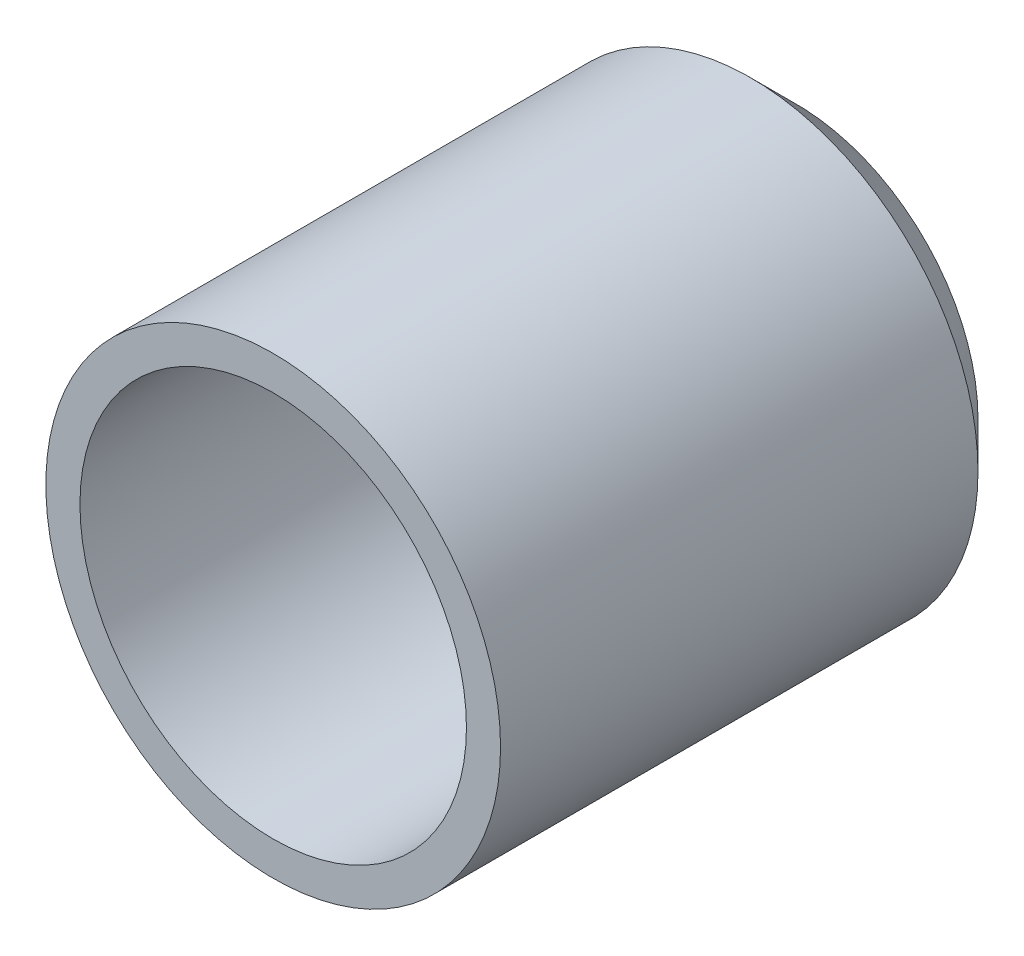
ISO-10303-21;
HEADER;
FILE_DESCRIPTION(('STEP AP214'),'2;1');
FILE_NAME('part.step','',(''),(''),'','','');
FILE_SCHEMA(('AUTOMOTIVE_DESIGN { 1 0 10303 214 1 1 1 1 }'));
ENDSEC;
DATA;
#1=APPLICATION_CONTEXT('core data for automotive mechanical design processes');
#2=APPLICATION_PROTOCOL_DEFINITION('international standard','automotive_design',2000,#1);
#3=PRODUCT_CONTEXT('',#1,'mechanical');
#4=PRODUCT('Part','Part','',(#3));
#5=PRODUCT_RELATED_PRODUCT_CATEGORY('part','',(#4));
#6=PRODUCT_DEFINITION_FORMATION('','',#4);
#7=PRODUCT_DEFINITION_CONTEXT('part definition',#1,'design');
#8=PRODUCT_DEFINITION('design','',#6,#7);
#9=PRODUCT_DEFINITION_SHAPE('','',#8);
#10=(LENGTH_UNIT() NAMED_UNIT(*) SI_UNIT(.MILLI.,.METRE.));
#11=(NAMED_UNIT(*) PLANE_ANGLE_UNIT() SI_UNIT($,.RADIAN.));
#12=(NAMED_UNIT(*) SI_UNIT($,.STERADIAN.) SOLID_ANGLE_UNIT());
#13=UNCERTAINTY_MEASURE_WITH_UNIT(LENGTH_MEASURE(1.E-05),#10,'distance_accuracy_value','');
#14=(GEOMETRIC_REPRESENTATION_CONTEXT(3) GLOBAL_UNCERTAINTY_ASSIGNED_CONTEXT((#13)) GLOBAL_UNIT_ASSIGNED_CONTEXT((#10,
#11,#12)) REPRESENTATION_CONTEXT('',''));
#15=CARTESIAN_POINT('',(0.,0.,0.));
#16=DIRECTION('',(0.,0.,1.));
#17=DIRECTION('',(1.,0.,0.));
#18=AXIS2_PLACEMENT_3D('',#15,#16,#17);
#19=CARTESIAN_POINT('',(0.,0.,-23.));
#20=DIRECTION('',(0.,0.,1.));
#21=DIRECTION('',(1.,0.,0.));
#22=AXIS2_PLACEMENT_3D('',#19,#20,#21);
#23=CYLINDRICAL_SURFACE('',#22,10.);
#24=CARTESIAN_POINT('',(0.,0.,-21.));
#25=DIRECTION('',(0.,0.,1.));
#26=DIRECTION('',(1.,0.,0.));
#27=AXIS2_PLACEMENT_3D('',#24,#25,#26);
#28=CIRCLE('',#27,10.);
#29=CARTESIAN_POINT('',(10.,0.,-21.));
#30=VERTEX_POINT('',#29);
#31=EDGE_CURVE('E37',#30,#30,#28,.T.);
#32=ORIENTED_EDGE('',*,*,#31,.T.);
#33=EDGE_LOOP('',(#32));
#34=FACE_BOUND('',#33,.T.);
#35=CARTESIAN_POINT('',(0.,0.,0.));
#36=DIRECTION('',(0.,0.,1.));
#37=DIRECTION('',(1.,0.,0.));
#38=AXIS2_PLACEMENT_3D('',#35,#36,#37);
#39=CIRCLE('',#38,10.);
#40=CARTESIAN_POINT('',(10.,0.,0.));
#41=VERTEX_POINT('',#40);
#42=EDGE_CURVE('E41',#41,#41,#39,.T.);
#43=ORIENTED_EDGE('',*,*,#42,.F.);
#44=EDGE_LOOP('',(#43));
#45=FACE_BOUND('',#44,.T.);
#46=ADVANCED_FACE('F30',(#34,#45),#23,.T.);
#47=CARTESIAN_POINT('',(0.,0.,-23.));
#48=DIRECTION('',(0.,0.,1.));
#49=DIRECTION('',(1.,0.,0.));
#50=AXIS2_PLACEMENT_3D('',#47,#48,#49);
#51=PLANE('',#50);
#52=CARTESIAN_POINT('',(0.,0.,-23.));
#53=DIRECTION('',(0.,0.,1.));
#54=DIRECTION('',(1.,0.,0.));
#55=AXIS2_PLACEMENT_3D('',#52,#53,#54);
#56=CIRCLE('',#55,7.99999999999999);
#57=CARTESIAN_POINT('',(7.99999999999999,0.,-23.));
#58=VERTEX_POINT('',#57);
#59=EDGE_CURVE('E10',#58,#58,#56,.F.);
#60=ORIENTED_EDGE('',*,*,#59,.T.);
#61=EDGE_LOOP('',(#60));
#62=FACE_BOUND('',#61,.T.);
#63=ADVANCED_FACE('F65',(#62),#51,.F.);
#64=CARTESIAN_POINT('',(0.,0.,0.));
#65=DIRECTION('',(0.,0.,1.));
#66=DIRECTION('',(1.,0.,0.));
#67=AXIS2_PLACEMENT_3D('',#64,#65,#66);
#68=PLANE('',#67);
#69=CARTESIAN_POINT('',(0.,0.,0.));
#70=DIRECTION('',(0.,0.,1.));
#71=DIRECTION('',(1.,0.,0.));
#72=AXIS2_PLACEMENT_3D('',#69,#70,#71);
#73=CIRCLE('',#72,8.5);
#74=CARTESIAN_POINT('',(8.5,0.,0.));
#75=VERTEX_POINT('',#74);
#76=EDGE_CURVE('E48',#75,#75,#73,.T.);
#77=ORIENTED_EDGE('',*,*,#76,.F.);
#78=EDGE_LOOP('',(#77));
#79=FACE_BOUND('',#78,.T.);
#80=ORIENTED_EDGE('',*,*,#42,.T.);
#81=EDGE_LOOP('',(#80));
#82=FACE_BOUND('',#81,.T.);
#83=ADVANCED_FACE('F62',(#79,#82),#68,.T.);
#84=CARTESIAN_POINT('',(0.,0.,-21.));
#85=DIRECTION('',(0.,0.,1.));
#86=DIRECTION('',(1.,0.,0.));
#87=AXIS2_PLACEMENT_3D('',#84,#85,#86);
#88=CONICAL_SURFACE('',#87,10.,0.78539816339745);
#89=ORIENTED_EDGE('',*,*,#59,.F.);
#90=EDGE_LOOP('',(#89));
#91=FACE_BOUND('',#90,.T.);
#92=ORIENTED_EDGE('',*,*,#31,.F.);
#93=EDGE_LOOP('',(#92));
#94=FACE_BOUND('',#93,.T.);
#95=ADVANCED_FACE('F32',(#91,#94),#88,.T.);
#96=CARTESIAN_POINT('',(0.,0.,-15.));
#97=DIRECTION('',(0.,0.,1.));
#98=DIRECTION('',(1.,0.,0.));
#99=AXIS2_PLACEMENT_3D('',#96,#97,#98);
#100=CYLINDRICAL_SURFACE('',#99,8.5);
#101=CARTESIAN_POINT('',(0.,0.,-15.));
#102=DIRECTION('',(0.,0.,1.));
#103=DIRECTION('',(1.,0.,0.));
#104=AXIS2_PLACEMENT_3D('',#101,#102,#103);
#105=CIRCLE('',#104,8.5);
#106=CARTESIAN_POINT('',(8.5,0.,-15.));
#107=VERTEX_POINT('',#106);
#108=EDGE_CURVE('E45',#107,#107,#105,.T.);
#109=ORIENTED_EDGE('',*,*,#108,.F.);
#110=EDGE_LOOP('',(#109));
#111=FACE_BOUND('',#110,.T.);
#112=ORIENTED_EDGE('',*,*,#76,.T.);
#113=EDGE_LOOP('',(#112));
#114=FACE_BOUND('',#113,.T.);
#115=ADVANCED_FACE('F56',(#111,#114),#100,.F.);
#116=CARTESIAN_POINT('',(0.,0.,-15.));
#117=DIRECTION('',(0.,0.,1.));
#118=DIRECTION('',(1.,0.,0.));
#119=AXIS2_PLACEMENT_3D('',#116,#117,#118);
#120=PLANE('',#119);
#121=ORIENTED_EDGE('',*,*,#108,.T.);
#122=EDGE_LOOP('',(#121));
#123=FACE_BOUND('',#122,.T.);
#124=ADVANCED_FACE('F54',(#123),#120,.T.);
#125=CLOSED_SHELL('',(#46,#63,#83,#95,#115,#124));
#126=MANIFOLD_SOLID_BREP('B2',#125);
#127=ADVANCED_BREP_SHAPE_REPRESENTATION('',(#18,#126),#14);
#128=SHAPE_DEFINITION_REPRESENTATION(#9,#127);
ENDSEC;
END-ISO-10303-21;
